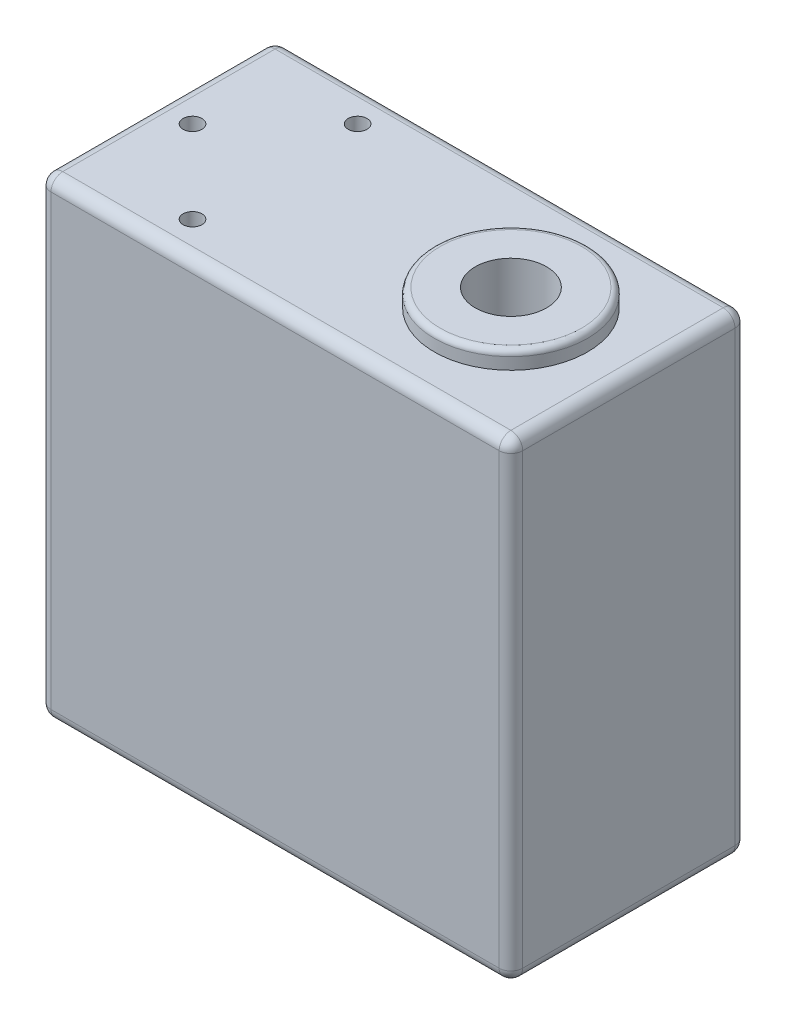
ISO-10303-21;
HEADER;
FILE_DESCRIPTION(('STEP AP214'),'2;1');
FILE_NAME('part.step','',(''),(''),'','','');
FILE_SCHEMA(('AUTOMOTIVE_DESIGN { 1 0 10303 214 1 1 1 1 }'));
ENDSEC;
DATA;
#1=APPLICATION_CONTEXT('core data for automotive mechanical design processes');
#2=APPLICATION_PROTOCOL_DEFINITION('international standard','automotive_design',2000,#1);
#3=PRODUCT_CONTEXT('',#1,'mechanical');
#4=PRODUCT('Part','Part','',(#3));
#5=PRODUCT_RELATED_PRODUCT_CATEGORY('part','',(#4));
#6=PRODUCT_DEFINITION_FORMATION('','',#4);
#7=PRODUCT_DEFINITION_CONTEXT('part definition',#1,'design');
#8=PRODUCT_DEFINITION('design','',#6,#7);
#9=PRODUCT_DEFINITION_SHAPE('','',#8);
#10=(LENGTH_UNIT() NAMED_UNIT(*) SI_UNIT(.MILLI.,.METRE.));
#11=(NAMED_UNIT(*) PLANE_ANGLE_UNIT() SI_UNIT($,.RADIAN.));
#12=(NAMED_UNIT(*) SI_UNIT($,.STERADIAN.) SOLID_ANGLE_UNIT());
#13=UNCERTAINTY_MEASURE_WITH_UNIT(LENGTH_MEASURE(1.E-05),#10,'distance_accuracy_value','');
#14=(GEOMETRIC_REPRESENTATION_CONTEXT(3) GLOBAL_UNCERTAINTY_ASSIGNED_CONTEXT((#13)) GLOBAL_UNIT_ASSIGNED_CONTEXT((#10,
#11,#12)) REPRESENTATION_CONTEXT('',''));
#15=CARTESIAN_POINT('',(0.,0.,0.));
#16=DIRECTION('',(0.,0.,1.));
#17=DIRECTION('',(1.,0.,0.));
#18=AXIS2_PLACEMENT_3D('',#15,#16,#17);
#19=CARTESIAN_POINT('',(20.,20.,10.));
#20=DIRECTION('',(-1.,0.,0.));
#21=DIRECTION('',(0.,-1.,0.));
#22=AXIS2_PLACEMENT_3D('',#19,#20,#21);
#23=PLANE('',#22);
#24=DIRECTION('',(0.,0.,-1.));
#25=VECTOR('',#24,1.);
#26=CARTESIAN_POINT('',(20.,-19.,10.));
#27=LINE('',#26,#25);
#28=CARTESIAN_POINT('',(20.,-19.,9.));
#29=VERTEX_POINT('',#28);
#30=CARTESIAN_POINT('',(20.,-19.,-9.));
#31=VERTEX_POINT('',#30);
#32=EDGE_CURVE('E189',#29,#31,#27,.T.);
#33=ORIENTED_EDGE('',*,*,#32,.T.);
#34=DIRECTION('',(0.,1.,0.));
#35=VECTOR('',#34,1.);
#36=CARTESIAN_POINT('',(20.,20.,-9.));
#37=LINE('',#36,#35);
#38=CARTESIAN_POINT('',(20.,19.,-9.));
#39=VERTEX_POINT('',#38);
#40=EDGE_CURVE('E192',#31,#39,#37,.T.);
#41=ORIENTED_EDGE('',*,*,#40,.T.);
#42=DIRECTION('',(0.,0.,-1.));
#43=VECTOR('',#42,1.);
#44=CARTESIAN_POINT('',(20.,19.,10.));
#45=LINE('',#44,#43);
#46=CARTESIAN_POINT('',(20.,19.,9.));
#47=VERTEX_POINT('',#46);
#48=EDGE_CURVE('E187',#39,#47,#45,.F.);
#49=ORIENTED_EDGE('',*,*,#48,.T.);
#50=DIRECTION('',(0.,1.,0.));
#51=VECTOR('',#50,1.);
#52=CARTESIAN_POINT('',(20.,-20.,9.));
#53=LINE('',#52,#51);
#54=EDGE_CURVE('E185',#47,#29,#53,.F.);
#55=ORIENTED_EDGE('',*,*,#54,.T.);
#56=EDGE_LOOP('',(#33,#41,#49,#55));
#57=FACE_BOUND('',#56,.T.);
#58=ADVANCED_FACE('F33',(#57),#23,.F.);
#59=CARTESIAN_POINT('',(-20.,20.,10.));
#60=DIRECTION('',(0.,-1.,0.));
#61=DIRECTION('',(0.,0.,-1.));
#62=AXIS2_PLACEMENT_3D('',#59,#60,#61);
#63=PLANE('',#62);
#64=CARTESIAN_POINT('',(10.,20.,0.));
#65=DIRECTION('',(0.,-1.,0.));
#66=DIRECTION('',(0.,0.,-1.));
#67=AXIS2_PLACEMENT_3D('',#64,#65,#66);
#68=CIRCLE('',#67,6.5);
#69=CARTESIAN_POINT('',(10.,20.,-6.5));
#70=VERTEX_POINT('',#69);
#71=EDGE_CURVE('E278',#70,#70,#68,.F.);
#72=ORIENTED_EDGE('',*,*,#71,.F.);
#73=EDGE_LOOP('',(#72));
#74=FACE_BOUND('',#73,.T.);
#75=CARTESIAN_POINT('',(-17.,20.,0.));
#76=DIRECTION('',(0.,1.,0.));
#77=DIRECTION('',(0.,0.,1.));
#78=AXIS2_PLACEMENT_3D('',#75,#76,#77);
#79=CIRCLE('',#78,0.799999999999999);
#80=CARTESIAN_POINT('',(-17.,20.,0.800000000000037));
#81=VERTEX_POINT('',#80);
#82=EDGE_CURVE('E424',#81,#81,#79,.T.);
#83=ORIENTED_EDGE('',*,*,#82,.F.);
#84=EDGE_LOOP('',(#83));
#85=FACE_BOUND('',#84,.T.);
#86=CARTESIAN_POINT('',(-9.99999999999994,20.,7.00000000000001));
#87=DIRECTION('',(0.,1.,0.));
#88=DIRECTION('',(0.,0.,1.));
#89=AXIS2_PLACEMENT_3D('',#86,#87,#88);
#90=CIRCLE('',#89,0.800000000000001);
#91=CARTESIAN_POINT('',(-9.99999999999994,20.,7.80000000000001));
#92=VERTEX_POINT('',#91);
#93=EDGE_CURVE('E267',#92,#92,#90,.T.);
#94=ORIENTED_EDGE('',*,*,#93,.F.);
#95=EDGE_LOOP('',(#94));
#96=FACE_BOUND('',#95,.T.);
#97=CARTESIAN_POINT('',(-10.,20.,-6.99999999999999));
#98=DIRECTION('',(0.,1.,0.));
#99=DIRECTION('',(0.,0.,1.));
#100=AXIS2_PLACEMENT_3D('',#97,#98,#99);
#101=CIRCLE('',#100,0.800000000000001);
#102=CARTESIAN_POINT('',(-10.,20.,-6.19999999999999));
#103=VERTEX_POINT('',#102);
#104=EDGE_CURVE('E423',#103,#103,#101,.T.);
#105=ORIENTED_EDGE('',*,*,#104,.F.);
#106=EDGE_LOOP('',(#105));
#107=FACE_BOUND('',#106,.T.);
#108=DIRECTION('',(0.,0.,-1.));
#109=VECTOR('',#108,1.);
#110=CARTESIAN_POINT('',(19.,20.,10.));
#111=LINE('',#110,#109);
#112=CARTESIAN_POINT('',(19.,20.,9.));
#113=VERTEX_POINT('',#112);
#114=CARTESIAN_POINT('',(19.,20.,-9.));
#115=VERTEX_POINT('',#114);
#116=EDGE_CURVE('E171',#113,#115,#111,.T.);
#117=ORIENTED_EDGE('',*,*,#116,.T.);
#118=DIRECTION('',(-1.,0.,0.));
#119=VECTOR('',#118,1.);
#120=CARTESIAN_POINT('',(-20.,20.,-9.));
#121=LINE('',#120,#119);
#122=CARTESIAN_POINT('',(-19.,20.,-9.));
#123=VERTEX_POINT('',#122);
#124=EDGE_CURVE('E176',#115,#123,#121,.T.);
#125=ORIENTED_EDGE('',*,*,#124,.T.);
#126=DIRECTION('',(0.,0.,-1.));
#127=VECTOR('',#126,1.);
#128=CARTESIAN_POINT('',(-19.,20.,10.));
#129=LINE('',#128,#127);
#130=CARTESIAN_POINT('',(-19.,20.,9.));
#131=VERTEX_POINT('',#130);
#132=EDGE_CURVE('E173',#123,#131,#129,.F.);
#133=ORIENTED_EDGE('',*,*,#132,.T.);
#134=DIRECTION('',(-1.,0.,0.));
#135=VECTOR('',#134,1.);
#136=CARTESIAN_POINT('',(20.,20.,9.));
#137=LINE('',#136,#135);
#138=EDGE_CURVE('E169',#131,#113,#137,.F.);
#139=ORIENTED_EDGE('',*,*,#138,.T.);
#140=EDGE_LOOP('',(#117,#125,#133,#139));
#141=FACE_BOUND('',#140,.T.);
#142=ADVANCED_FACE('F297',(#74,#85,#96,#107,#141),#63,.F.);
#143=CARTESIAN_POINT('',(-20.,20.,10.));
#144=DIRECTION('',(1.,0.,0.));
#145=DIRECTION('',(0.,1.,0.));
#146=AXIS2_PLACEMENT_3D('',#143,#144,#145);
#147=PLANE('',#146);
#148=DIRECTION('',(0.,0.,-1.));
#149=VECTOR('',#148,1.);
#150=CARTESIAN_POINT('',(-20.,19.,10.));
#151=LINE('',#150,#149);
#152=CARTESIAN_POINT('',(-20.,19.,9.));
#153=VERTEX_POINT('',#152);
#154=CARTESIAN_POINT('',(-20.,19.,-9.));
#155=VERTEX_POINT('',#154);
#156=EDGE_CURVE('E132',#153,#155,#151,.T.);
#157=ORIENTED_EDGE('',*,*,#156,.T.);
#158=DIRECTION('',(0.,-1.,0.));
#159=VECTOR('',#158,1.);
#160=CARTESIAN_POINT('',(-20.,20.,-9.));
#161=LINE('',#160,#159);
#162=CARTESIAN_POINT('',(-20.,-19.,-9.));
#163=VERTEX_POINT('',#162);
#164=EDGE_CURVE('E128',#155,#163,#161,.T.);
#165=ORIENTED_EDGE('',*,*,#164,.T.);
#166=DIRECTION('',(0.,0.,-1.));
#167=VECTOR('',#166,1.);
#168=CARTESIAN_POINT('',(-20.,-19.,10.));
#169=LINE('',#168,#167);
#170=CARTESIAN_POINT('',(-20.,-19.,9.));
#171=VERTEX_POINT('',#170);
#172=EDGE_CURVE('E120',#163,#171,#169,.F.);
#173=ORIENTED_EDGE('',*,*,#172,.T.);
#174=DIRECTION('',(0.,-1.,0.));
#175=VECTOR('',#174,1.);
#176=CARTESIAN_POINT('',(-20.,20.,9.));
#177=LINE('',#176,#175);
#178=EDGE_CURVE('E125',#171,#153,#177,.F.);
#179=ORIENTED_EDGE('',*,*,#178,.T.);
#180=EDGE_LOOP('',(#157,#165,#173,#179));
#181=FACE_BOUND('',#180,.T.);
#182=ADVANCED_FACE('F123',(#181),#147,.F.);
#183=CARTESIAN_POINT('',(-20.,-20.,10.));
#184=DIRECTION('',(0.,1.,0.));
#185=DIRECTION('',(0.,0.,1.));
#186=AXIS2_PLACEMENT_3D('',#183,#184,#185);
#187=PLANE('',#186);
#188=CARTESIAN_POINT('',(10.,-20.,0.));
#189=DIRECTION('',(0.,1.,0.));
#190=DIRECTION('',(0.,0.,1.));
#191=AXIS2_PLACEMENT_3D('',#188,#189,#190);
#192=CIRCLE('',#191,6.5);
#193=CARTESIAN_POINT('',(10.,-20.,6.5));
#194=VERTEX_POINT('',#193);
#195=EDGE_CURVE('E209',#194,#194,#192,.F.);
#196=ORIENTED_EDGE('',*,*,#195,.F.);
#197=EDGE_LOOP('',(#196));
#198=FACE_BOUND('',#197,.T.);
#199=CARTESIAN_POINT('',(-2.49999999999997,-20.,7.49999999999997));
#200=DIRECTION('',(0.,-1.,0.));
#201=DIRECTION('',(0.,0.,-1.));
#202=AXIS2_PLACEMENT_3D('',#199,#200,#201);
#203=CIRCLE('',#202,0.800000000000001);
#204=CARTESIAN_POINT('',(-2.49999999999997,-20.,6.69999999999997));
#205=VERTEX_POINT('',#204);
#206=EDGE_CURVE('E441',#205,#205,#203,.T.);
#207=ORIENTED_EDGE('',*,*,#206,.F.);
#208=EDGE_LOOP('',(#207));
#209=FACE_BOUND('',#208,.T.);
#210=CARTESIAN_POINT('',(-2.50000000000005,-20.,-7.50000000000005));
#211=DIRECTION('',(0.,-1.,0.));
#212=DIRECTION('',(0.,0.,-1.));
#213=AXIS2_PLACEMENT_3D('',#210,#211,#212);
#214=CIRCLE('',#213,0.799999999999997);
#215=CARTESIAN_POINT('',(-2.50000000000005,-20.,-8.30000000000005));
#216=VERTEX_POINT('',#215);
#217=EDGE_CURVE('E447',#216,#216,#214,.T.);
#218=ORIENTED_EDGE('',*,*,#217,.F.);
#219=EDGE_LOOP('',(#218));
#220=FACE_BOUND('',#219,.T.);
#221=CARTESIAN_POINT('',(-17.5000000000001,-20.,-7.49999999999992));
#222=DIRECTION('',(0.,-1.,0.));
#223=DIRECTION('',(0.,0.,-1.));
#224=AXIS2_PLACEMENT_3D('',#221,#222,#223);
#225=CIRCLE('',#224,0.8);
#226=CARTESIAN_POINT('',(-17.5000000000001,-20.,-8.29999999999992));
#227=VERTEX_POINT('',#226);
#228=EDGE_CURVE('E435',#227,#227,#225,.T.);
#229=ORIENTED_EDGE('',*,*,#228,.F.);
#230=EDGE_LOOP('',(#229));
#231=FACE_BOUND('',#230,.T.);
#232=CARTESIAN_POINT('',(-17.5,-20.,7.5));
#233=DIRECTION('',(0.,-1.,0.));
#234=DIRECTION('',(0.,0.,-1.));
#235=AXIS2_PLACEMENT_3D('',#232,#233,#234);
#236=CIRCLE('',#235,0.799999999999999);
#237=CARTESIAN_POINT('',(-17.5,-20.,6.7));
#238=VERTEX_POINT('',#237);
#239=EDGE_CURVE('E164',#238,#238,#236,.T.);
#240=ORIENTED_EDGE('',*,*,#239,.F.);
#241=EDGE_LOOP('',(#240));
#242=FACE_BOUND('',#241,.T.);
#243=DIRECTION('',(0.,0.,-1.));
#244=VECTOR('',#243,1.);
#245=CARTESIAN_POINT('',(-19.,-20.,10.));
#246=LINE('',#245,#244);
#247=CARTESIAN_POINT('',(-19.,-20.,9.));
#248=VERTEX_POINT('',#247);
#249=CARTESIAN_POINT('',(-19.,-20.,-9.));
#250=VERTEX_POINT('',#249);
#251=EDGE_CURVE('E140',#248,#250,#246,.T.);
#252=ORIENTED_EDGE('',*,*,#251,.T.);
#253=DIRECTION('',(1.,0.,0.));
#254=VECTOR('',#253,1.);
#255=CARTESIAN_POINT('',(-20.,-20.,-9.));
#256=LINE('',#255,#254);
#257=CARTESIAN_POINT('',(19.,-20.,-9.));
#258=VERTEX_POINT('',#257);
#259=EDGE_CURVE('E183',#250,#258,#256,.T.);
#260=ORIENTED_EDGE('',*,*,#259,.T.);
#261=DIRECTION('',(0.,0.,-1.));
#262=VECTOR('',#261,1.);
#263=CARTESIAN_POINT('',(19.,-20.,10.));
#264=LINE('',#263,#262);
#265=CARTESIAN_POINT('',(19.,-20.,9.));
#266=VERTEX_POINT('',#265);
#267=EDGE_CURVE('E180',#258,#266,#264,.F.);
#268=ORIENTED_EDGE('',*,*,#267,.T.);
#269=DIRECTION('',(1.,0.,0.));
#270=VECTOR('',#269,1.);
#271=CARTESIAN_POINT('',(-20.,-20.,9.));
#272=LINE('',#271,#270);
#273=EDGE_CURVE('E178',#266,#248,#272,.F.);
#274=ORIENTED_EDGE('',*,*,#273,.T.);
#275=EDGE_LOOP('',(#252,#260,#268,#274));
#276=FACE_BOUND('',#275,.T.);
#277=ADVANCED_FACE('F461',(#198,#209,#220,#231,#242,#276),#187,.F.);
#278=CARTESIAN_POINT('',(0.,0.,10.));
#279=DIRECTION('',(0.,0.,1.));
#280=DIRECTION('',(1.,0.,0.));
#281=AXIS2_PLACEMENT_3D('',#278,#279,#280);
#282=PLANE('',#281);
#283=DIRECTION('',(0.,-1.,0.));
#284=VECTOR('',#283,1.);
#285=CARTESIAN_POINT('',(-19.,-20.,10.));
#286=LINE('',#285,#284);
#287=CARTESIAN_POINT('',(-19.,19.,10.));
#288=VERTEX_POINT('',#287);
#289=CARTESIAN_POINT('',(-19.,-19.,10.));
#290=VERTEX_POINT('',#289);
#291=EDGE_CURVE('E48',#288,#290,#286,.T.);
#292=ORIENTED_EDGE('',*,*,#291,.T.);
#293=DIRECTION('',(1.,0.,0.));
#294=VECTOR('',#293,1.);
#295=CARTESIAN_POINT('',(20.,-19.,10.));
#296=LINE('',#295,#294);
#297=CARTESIAN_POINT('',(19.,-19.,10.));
#298=VERTEX_POINT('',#297);
#299=EDGE_CURVE('E207',#290,#298,#296,.T.);
#300=ORIENTED_EDGE('',*,*,#299,.T.);
#301=DIRECTION('',(0.,1.,0.));
#302=VECTOR('',#301,1.);
#303=CARTESIAN_POINT('',(19.,20.,10.));
#304=LINE('',#303,#302);
#305=CARTESIAN_POINT('',(19.,19.,10.));
#306=VERTEX_POINT('',#305);
#307=EDGE_CURVE('E203',#298,#306,#304,.T.);
#308=ORIENTED_EDGE('',*,*,#307,.T.);
#309=DIRECTION('',(-1.,0.,0.));
#310=VECTOR('',#309,1.);
#311=CARTESIAN_POINT('',(-20.,19.,10.));
#312=LINE('',#311,#310);
#313=EDGE_CURVE('E53',#306,#288,#312,.T.);
#314=ORIENTED_EDGE('',*,*,#313,.T.);
#315=EDGE_LOOP('',(#292,#300,#308,#314));
#316=FACE_BOUND('',#315,.T.);
#317=ADVANCED_FACE('F464',(#316),#282,.T.);
#318=CARTESIAN_POINT('',(0.,0.,-10.));
#319=DIRECTION('',(0.,0.,1.));
#320=DIRECTION('',(1.,0.,0.));
#321=AXIS2_PLACEMENT_3D('',#318,#319,#320);
#322=PLANE('',#321);
#323=DIRECTION('',(0.,-1.,0.));
#324=VECTOR('',#323,1.);
#325=CARTESIAN_POINT('',(-19.,0.,-10.));
#326=LINE('',#325,#324);
#327=CARTESIAN_POINT('',(-19.,-19.,-10.));
#328=VERTEX_POINT('',#327);
#329=CARTESIAN_POINT('',(-19.,19.,-10.));
#330=VERTEX_POINT('',#329);
#331=EDGE_CURVE('E198',#328,#330,#326,.F.);
#332=ORIENTED_EDGE('',*,*,#331,.T.);
#333=DIRECTION('',(-1.,0.,0.));
#334=VECTOR('',#333,1.);
#335=CARTESIAN_POINT('',(0.,19.,-10.));
#336=LINE('',#335,#334);
#337=CARTESIAN_POINT('',(19.,19.,-10.));
#338=VERTEX_POINT('',#337);
#339=EDGE_CURVE('E200',#330,#338,#336,.F.);
#340=ORIENTED_EDGE('',*,*,#339,.T.);
#341=DIRECTION('',(0.,1.,0.));
#342=VECTOR('',#341,1.);
#343=CARTESIAN_POINT('',(19.,0.,-10.));
#344=LINE('',#343,#342);
#345=CARTESIAN_POINT('',(19.,-19.,-10.));
#346=VERTEX_POINT('',#345);
#347=EDGE_CURVE('E194',#338,#346,#344,.F.);
#348=ORIENTED_EDGE('',*,*,#347,.T.);
#349=DIRECTION('',(1.,0.,0.));
#350=VECTOR('',#349,1.);
#351=CARTESIAN_POINT('',(0.,-19.,-10.));
#352=LINE('',#351,#350);
#353=EDGE_CURVE('E196',#346,#328,#352,.F.);
#354=ORIENTED_EDGE('',*,*,#353,.T.);
#355=EDGE_LOOP('',(#332,#340,#348,#354));
#356=FACE_BOUND('',#355,.T.);
#357=ADVANCED_FACE('F381',(#356),#322,.F.);
#358=CARTESIAN_POINT('',(19.,-19.,10.));
#359=DIRECTION('',(0.,0.,-1.));
#360=DIRECTION('',(-1.,0.,0.));
#361=AXIS2_PLACEMENT_3D('',#358,#359,#360);
#362=CYLINDRICAL_SURFACE('',#361,1.);
#363=CARTESIAN_POINT('',(19.,-19.,9.));
#364=DIRECTION('',(0.,0.,1.));
#365=DIRECTION('',(1.,0.,0.));
#366=AXIS2_PLACEMENT_3D('',#363,#364,#365);
#367=CIRCLE('',#366,1.);
#368=EDGE_CURVE('E158',#266,#29,#367,.T.);
#369=ORIENTED_EDGE('',*,*,#368,.F.);
#370=ORIENTED_EDGE('',*,*,#267,.F.);
#371=CARTESIAN_POINT('',(19.,-19.,-9.));
#372=DIRECTION('',(0.,0.,-1.));
#373=DIRECTION('',(-1.,0.,0.));
#374=AXIS2_PLACEMENT_3D('',#371,#372,#373);
#375=CIRCLE('',#374,1.);
#376=EDGE_CURVE('E161',#31,#258,#375,.T.);
#377=ORIENTED_EDGE('',*,*,#376,.F.);
#378=ORIENTED_EDGE('',*,*,#32,.F.);
#379=EDGE_LOOP('',(#369,#370,#377,#378));
#380=FACE_BOUND('',#379,.T.);
#381=ADVANCED_FACE('F378',(#380),#362,.T.);
#382=CARTESIAN_POINT('',(19.,-19.,9.));
#383=DIRECTION('',(0.,0.,1.));
#384=DIRECTION('',(1.,0.,0.));
#385=AXIS2_PLACEMENT_3D('',#382,#383,#384);
#386=SPHERICAL_SURFACE('',#385,1.);
#387=CARTESIAN_POINT('',(19.,-19.,9.));
#388=DIRECTION('',(1.,0.,0.));
#389=DIRECTION('',(0.,0.,-1.));
#390=AXIS2_PLACEMENT_3D('',#387,#388,#389);
#391=CIRCLE('',#390,1.);
#392=EDGE_CURVE('E253',#266,#298,#391,.F.);
#393=ORIENTED_EDGE('',*,*,#392,.F.);
#394=ORIENTED_EDGE('',*,*,#368,.T.);
#395=CARTESIAN_POINT('',(19.,-19.,9.));
#396=DIRECTION('',(0.,-1.,0.));
#397=DIRECTION('',(0.,0.,-1.));
#398=AXIS2_PLACEMENT_3D('',#395,#396,#397);
#399=CIRCLE('',#398,1.);
#400=EDGE_CURVE('E256',#298,#29,#399,.F.);
#401=ORIENTED_EDGE('',*,*,#400,.F.);
#402=EDGE_LOOP('',(#393,#394,#401));
#403=FACE_BOUND('',#402,.T.);
#404=ADVANCED_FACE('F374',(#403),#386,.T.);
#405=CARTESIAN_POINT('',(19.,-19.,-9.));
#406=DIRECTION('',(0.,0.,1.));
#407=DIRECTION('',(1.,0.,0.));
#408=AXIS2_PLACEMENT_3D('',#405,#406,#407);
#409=SPHERICAL_SURFACE('',#408,1.);
#410=CARTESIAN_POINT('',(19.,-19.,-9.));
#411=DIRECTION('',(0.,-1.,0.));
#412=DIRECTION('',(0.,0.,-1.));
#413=AXIS2_PLACEMENT_3D('',#410,#411,#412);
#414=CIRCLE('',#413,1.);
#415=EDGE_CURVE('E247',#31,#346,#414,.F.);
#416=ORIENTED_EDGE('',*,*,#415,.F.);
#417=ORIENTED_EDGE('',*,*,#376,.T.);
#418=CARTESIAN_POINT('',(19.,-19.,-9.));
#419=DIRECTION('',(1.,0.,0.));
#420=DIRECTION('',(0.,0.,-1.));
#421=AXIS2_PLACEMENT_3D('',#418,#419,#420);
#422=CIRCLE('',#421,1.);
#423=EDGE_CURVE('E250',#346,#258,#422,.F.);
#424=ORIENTED_EDGE('',*,*,#423,.F.);
#425=EDGE_LOOP('',(#416,#417,#424));
#426=FACE_BOUND('',#425,.T.);
#427=ADVANCED_FACE('F370',(#426),#409,.T.);
#428=CARTESIAN_POINT('',(19.,0.,9.));
#429=DIRECTION('',(0.,-1.,0.));
#430=DIRECTION('',(1.,0.,0.));
#431=AXIS2_PLACEMENT_3D('',#428,#429,#430);
#432=CYLINDRICAL_SURFACE('',#431,1.);
#433=ORIENTED_EDGE('',*,*,#400,.T.);
#434=ORIENTED_EDGE('',*,*,#54,.F.);
#435=CARTESIAN_POINT('',(19.,19.,9.));
#436=DIRECTION('',(0.,1.,0.));
#437=DIRECTION('',(0.,0.,1.));
#438=AXIS2_PLACEMENT_3D('',#435,#436,#437);
#439=CIRCLE('',#438,1.);
#440=EDGE_CURVE('E241',#306,#47,#439,.T.);
#441=ORIENTED_EDGE('',*,*,#440,.F.);
#442=ORIENTED_EDGE('',*,*,#307,.F.);
#443=EDGE_LOOP('',(#433,#434,#441,#442));
#444=FACE_BOUND('',#443,.T.);
#445=ADVANCED_FACE('F366',(#444),#432,.T.);
#446=CARTESIAN_POINT('',(0.,-19.,9.));
#447=DIRECTION('',(-1.,0.,0.));
#448=DIRECTION('',(0.,0.,1.));
#449=AXIS2_PLACEMENT_3D('',#446,#447,#448);
#450=CYLINDRICAL_SURFACE('',#449,1.);
#451=ORIENTED_EDGE('',*,*,#392,.T.);
#452=ORIENTED_EDGE('',*,*,#299,.F.);
#453=CARTESIAN_POINT('',(-19.,-19.,9.));
#454=DIRECTION('',(-1.,0.,0.));
#455=DIRECTION('',(0.,0.,1.));
#456=AXIS2_PLACEMENT_3D('',#453,#454,#455);
#457=CIRCLE('',#456,1.);
#458=EDGE_CURVE('E144',#248,#290,#457,.T.);
#459=ORIENTED_EDGE('',*,*,#458,.F.);
#460=ORIENTED_EDGE('',*,*,#273,.F.);
#461=EDGE_LOOP('',(#451,#452,#459,#460));
#462=FACE_BOUND('',#461,.T.);
#463=ADVANCED_FACE('F363',(#462),#450,.T.);
#464=CARTESIAN_POINT('',(-19.,-19.,10.));
#465=DIRECTION('',(0.,0.,-1.));
#466=DIRECTION('',(-1.,0.,0.));
#467=AXIS2_PLACEMENT_3D('',#464,#465,#466);
#468=CYLINDRICAL_SURFACE('',#467,1.);
#469=CARTESIAN_POINT('',(-19.,-19.,-9.));
#470=DIRECTION('',(0.,0.,-1.));
#471=DIRECTION('',(-1.,0.,0.));
#472=AXIS2_PLACEMENT_3D('',#469,#470,#471);
#473=CIRCLE('',#472,1.);
#474=EDGE_CURVE('E145',#250,#163,#473,.T.);
#475=ORIENTED_EDGE('',*,*,#474,.F.);
#476=ORIENTED_EDGE('',*,*,#251,.F.);
#477=CARTESIAN_POINT('',(-19.,-19.,9.));
#478=DIRECTION('',(0.,0.,1.));
#479=DIRECTION('',(1.,0.,0.));
#480=AXIS2_PLACEMENT_3D('',#477,#478,#479);
#481=CIRCLE('',#480,1.);
#482=EDGE_CURVE('E136',#171,#248,#481,.T.);
#483=ORIENTED_EDGE('',*,*,#482,.F.);
#484=ORIENTED_EDGE('',*,*,#172,.F.);
#485=EDGE_LOOP('',(#475,#476,#483,#484));
#486=FACE_BOUND('',#485,.T.);
#487=ADVANCED_FACE('F138',(#486),#468,.T.);
#488=CARTESIAN_POINT('',(-20.,-19.,-9.));
#489=DIRECTION('',(1.,0.,0.));
#490=DIRECTION('',(0.,0.,-1.));
#491=AXIS2_PLACEMENT_3D('',#488,#489,#490);
#492=CYLINDRICAL_SURFACE('',#491,1.);
#493=ORIENTED_EDGE('',*,*,#423,.T.);
#494=ORIENTED_EDGE('',*,*,#259,.F.);
#495=CARTESIAN_POINT('',(-19.,-19.,-9.));
#496=DIRECTION('',(-1.,0.,0.));
#497=DIRECTION('',(0.,0.,1.));
#498=AXIS2_PLACEMENT_3D('',#495,#496,#497);
#499=CIRCLE('',#498,1.);
#500=EDGE_CURVE('E237',#328,#250,#499,.T.);
#501=ORIENTED_EDGE('',*,*,#500,.F.);
#502=ORIENTED_EDGE('',*,*,#353,.F.);
#503=EDGE_LOOP('',(#493,#494,#501,#502));
#504=FACE_BOUND('',#503,.T.);
#505=ADVANCED_FACE('F356',(#504),#492,.T.);
#506=CARTESIAN_POINT('',(19.,20.,-9.));
#507=DIRECTION('',(0.,1.,0.));
#508=DIRECTION('',(-1.,0.,0.));
#509=AXIS2_PLACEMENT_3D('',#506,#507,#508);
#510=CYLINDRICAL_SURFACE('',#509,1.);
#511=ORIENTED_EDGE('',*,*,#415,.T.);
#512=ORIENTED_EDGE('',*,*,#347,.F.);
#513=CARTESIAN_POINT('',(19.,19.,-9.));
#514=DIRECTION('',(0.,1.,0.));
#515=DIRECTION('',(0.,0.,1.));
#516=AXIS2_PLACEMENT_3D('',#513,#514,#515);
#517=CIRCLE('',#516,1.);
#518=EDGE_CURVE('E234',#39,#338,#517,.T.);
#519=ORIENTED_EDGE('',*,*,#518,.F.);
#520=ORIENTED_EDGE('',*,*,#40,.F.);
#521=EDGE_LOOP('',(#511,#512,#519,#520));
#522=FACE_BOUND('',#521,.T.);
#523=ADVANCED_FACE('F352',(#522),#510,.T.);
#524=CARTESIAN_POINT('',(19.,19.,10.));
#525=DIRECTION('',(0.,0.,-1.));
#526=DIRECTION('',(-1.,0.,0.));
#527=AXIS2_PLACEMENT_3D('',#524,#525,#526);
#528=CYLINDRICAL_SURFACE('',#527,1.);
#529=CARTESIAN_POINT('',(19.,19.,9.));
#530=DIRECTION('',(0.,0.,1.));
#531=DIRECTION('',(1.,0.,0.));
#532=AXIS2_PLACEMENT_3D('',#529,#530,#531);
#533=CIRCLE('',#532,1.);
#534=EDGE_CURVE('E244',#47,#113,#533,.T.);
#535=ORIENTED_EDGE('',*,*,#534,.F.);
#536=ORIENTED_EDGE('',*,*,#48,.F.);
#537=CARTESIAN_POINT('',(19.,19.,-9.));
#538=DIRECTION('',(0.,0.,-1.));
#539=DIRECTION('',(-1.,0.,0.));
#540=AXIS2_PLACEMENT_3D('',#537,#538,#539);
#541=CIRCLE('',#540,1.);
#542=EDGE_CURVE('E231',#115,#39,#541,.T.);
#543=ORIENTED_EDGE('',*,*,#542,.F.);
#544=ORIENTED_EDGE('',*,*,#116,.F.);
#545=EDGE_LOOP('',(#535,#536,#543,#544));
#546=FACE_BOUND('',#545,.T.);
#547=ADVANCED_FACE('F348',(#546),#528,.T.);
#548=CARTESIAN_POINT('',(19.,19.,9.));
#549=DIRECTION('',(0.,0.,1.));
#550=DIRECTION('',(1.,0.,0.));
#551=AXIS2_PLACEMENT_3D('',#548,#549,#550);
#552=SPHERICAL_SURFACE('',#551,1.);
#553=ORIENTED_EDGE('',*,*,#440,.T.);
#554=ORIENTED_EDGE('',*,*,#534,.T.);
#555=CARTESIAN_POINT('',(19.,19.,9.));
#556=DIRECTION('',(1.,0.,0.));
#557=DIRECTION('',(0.,0.,-1.));
#558=AXIS2_PLACEMENT_3D('',#555,#556,#557);
#559=CIRCLE('',#558,1.);
#560=EDGE_CURVE('E151',#306,#113,#559,.F.);
#561=ORIENTED_EDGE('',*,*,#560,.F.);
#562=EDGE_LOOP('',(#553,#554,#561));
#563=FACE_BOUND('',#562,.T.);
#564=ADVANCED_FACE('F345',(#563),#552,.T.);
#565=CARTESIAN_POINT('',(-19.,-19.,9.));
#566=DIRECTION('',(0.,0.,1.));
#567=DIRECTION('',(1.,0.,0.));
#568=AXIS2_PLACEMENT_3D('',#565,#566,#567);
#569=SPHERICAL_SURFACE('',#568,1.);
#570=ORIENTED_EDGE('',*,*,#482,.T.);
#571=ORIENTED_EDGE('',*,*,#458,.T.);
#572=CARTESIAN_POINT('',(-19.,-19.,9.));
#573=DIRECTION('',(0.,-1.,0.));
#574=DIRECTION('',(0.,0.,-1.));
#575=AXIS2_PLACEMENT_3D('',#572,#573,#574);
#576=CIRCLE('',#575,1.);
#577=EDGE_CURVE('E148',#171,#290,#576,.F.);
#578=ORIENTED_EDGE('',*,*,#577,.F.);
#579=EDGE_LOOP('',(#570,#571,#578));
#580=FACE_BOUND('',#579,.T.);
#581=ADVANCED_FACE('F149',(#580),#569,.T.);
#582=CARTESIAN_POINT('',(-19.,-19.,-9.));
#583=DIRECTION('',(0.,0.,1.));
#584=DIRECTION('',(1.,0.,0.));
#585=AXIS2_PLACEMENT_3D('',#582,#583,#584);
#586=SPHERICAL_SURFACE('',#585,1.);
#587=ORIENTED_EDGE('',*,*,#500,.T.);
#588=ORIENTED_EDGE('',*,*,#474,.T.);
#589=CARTESIAN_POINT('',(-19.,-19.,-9.));
#590=DIRECTION('',(0.,-1.,0.));
#591=DIRECTION('',(0.,0.,-1.));
#592=AXIS2_PLACEMENT_3D('',#589,#590,#591);
#593=CIRCLE('',#592,1.);
#594=EDGE_CURVE('E152',#328,#163,#593,.F.);
#595=ORIENTED_EDGE('',*,*,#594,.F.);
#596=EDGE_LOOP('',(#587,#588,#595));
#597=FACE_BOUND('',#596,.T.);
#598=ADVANCED_FACE('F338',(#597),#586,.T.);
#599=CARTESIAN_POINT('',(19.,19.,-9.));
#600=DIRECTION('',(0.,0.,1.));
#601=DIRECTION('',(1.,0.,0.));
#602=AXIS2_PLACEMENT_3D('',#599,#600,#601);
#603=SPHERICAL_SURFACE('',#602,1.);
#604=ORIENTED_EDGE('',*,*,#542,.T.);
#605=ORIENTED_EDGE('',*,*,#518,.T.);
#606=CARTESIAN_POINT('',(19.,19.,-9.));
#607=DIRECTION('',(1.,0.,0.));
#608=DIRECTION('',(0.,0.,-1.));
#609=AXIS2_PLACEMENT_3D('',#606,#607,#608);
#610=CIRCLE('',#609,1.);
#611=EDGE_CURVE('E225',#115,#338,#610,.F.);
#612=ORIENTED_EDGE('',*,*,#611,.F.);
#613=EDGE_LOOP('',(#604,#605,#612));
#614=FACE_BOUND('',#613,.T.);
#615=ADVANCED_FACE('F334',(#614),#603,.T.);
#616=CARTESIAN_POINT('',(0.,19.,9.));
#617=DIRECTION('',(1.,0.,0.));
#618=DIRECTION('',(0.,0.,-1.));
#619=AXIS2_PLACEMENT_3D('',#616,#617,#618);
#620=CYLINDRICAL_SURFACE('',#619,1.);
#621=ORIENTED_EDGE('',*,*,#560,.T.);
#622=ORIENTED_EDGE('',*,*,#138,.F.);
#623=CARTESIAN_POINT('',(-19.,19.,9.));
#624=DIRECTION('',(-1.,0.,0.));
#625=DIRECTION('',(0.,0.,1.));
#626=AXIS2_PLACEMENT_3D('',#623,#624,#625);
#627=CIRCLE('',#626,1.);
#628=EDGE_CURVE('E222',#288,#131,#627,.T.);
#629=ORIENTED_EDGE('',*,*,#628,.F.);
#630=ORIENTED_EDGE('',*,*,#313,.F.);
#631=EDGE_LOOP('',(#621,#622,#629,#630));
#632=FACE_BOUND('',#631,.T.);
#633=ADVANCED_FACE('F331',(#632),#620,.T.);
#634=CARTESIAN_POINT('',(-19.,0.,9.));
#635=DIRECTION('',(0.,1.,0.));
#636=DIRECTION('',(-1.,0.,0.));
#637=AXIS2_PLACEMENT_3D('',#634,#635,#636);
#638=CYLINDRICAL_SURFACE('',#637,1.);
#639=ORIENTED_EDGE('',*,*,#577,.T.);
#640=ORIENTED_EDGE('',*,*,#291,.F.);
#641=CARTESIAN_POINT('',(-19.,19.,9.));
#642=DIRECTION('',(0.,1.,0.));
#643=DIRECTION('',(0.,0.,1.));
#644=AXIS2_PLACEMENT_3D('',#641,#642,#643);
#645=CIRCLE('',#644,1.);
#646=EDGE_CURVE('E156',#153,#288,#645,.T.);
#647=ORIENTED_EDGE('',*,*,#646,.F.);
#648=ORIENTED_EDGE('',*,*,#178,.F.);
#649=EDGE_LOOP('',(#639,#640,#647,#648));
#650=FACE_BOUND('',#649,.T.);
#651=ADVANCED_FACE('F154',(#650),#638,.T.);
#652=CARTESIAN_POINT('',(-19.,20.,-9.));
#653=DIRECTION('',(0.,-1.,0.));
#654=DIRECTION('',(1.,0.,0.));
#655=AXIS2_PLACEMENT_3D('',#652,#653,#654);
#656=CYLINDRICAL_SURFACE('',#655,1.);
#657=ORIENTED_EDGE('',*,*,#594,.T.);
#658=ORIENTED_EDGE('',*,*,#164,.F.);
#659=CARTESIAN_POINT('',(-19.,19.,-9.));
#660=DIRECTION('',(0.,1.,0.));
#661=DIRECTION('',(0.,0.,1.));
#662=AXIS2_PLACEMENT_3D('',#659,#660,#661);
#663=CIRCLE('',#662,1.);
#664=EDGE_CURVE('E218',#330,#155,#663,.T.);
#665=ORIENTED_EDGE('',*,*,#664,.F.);
#666=ORIENTED_EDGE('',*,*,#331,.F.);
#667=EDGE_LOOP('',(#657,#658,#665,#666));
#668=FACE_BOUND('',#667,.T.);
#669=ADVANCED_FACE('F324',(#668),#656,.T.);
#670=CARTESIAN_POINT('',(-20.,19.,-9.));
#671=DIRECTION('',(-1.,0.,0.));
#672=DIRECTION('',(0.,0.,1.));
#673=AXIS2_PLACEMENT_3D('',#670,#671,#672);
#674=CYLINDRICAL_SURFACE('',#673,1.);
#675=ORIENTED_EDGE('',*,*,#611,.T.);
#676=ORIENTED_EDGE('',*,*,#339,.F.);
#677=CARTESIAN_POINT('',(-19.,19.,-9.));
#678=DIRECTION('',(-1.,0.,0.));
#679=DIRECTION('',(0.,0.,1.));
#680=AXIS2_PLACEMENT_3D('',#677,#678,#679);
#681=CIRCLE('',#680,1.);
#682=EDGE_CURVE('E215',#123,#330,#681,.T.);
#683=ORIENTED_EDGE('',*,*,#682,.F.);
#684=ORIENTED_EDGE('',*,*,#124,.F.);
#685=EDGE_LOOP('',(#675,#676,#683,#684));
#686=FACE_BOUND('',#685,.T.);
#687=ADVANCED_FACE('F320',(#686),#674,.T.);
#688=CARTESIAN_POINT('',(-19.,19.,9.));
#689=DIRECTION('',(0.,0.,1.));
#690=DIRECTION('',(1.,0.,0.));
#691=AXIS2_PLACEMENT_3D('',#688,#689,#690);
#692=SPHERICAL_SURFACE('',#691,1.);
#693=ORIENTED_EDGE('',*,*,#646,.T.);
#694=ORIENTED_EDGE('',*,*,#628,.T.);
#695=CARTESIAN_POINT('',(-19.,19.,9.));
#696=DIRECTION('',(0.,0.,1.));
#697=DIRECTION('',(1.,0.,0.));
#698=AXIS2_PLACEMENT_3D('',#695,#696,#697);
#699=CIRCLE('',#698,1.);
#700=EDGE_CURVE('E212',#153,#131,#699,.F.);
#701=ORIENTED_EDGE('',*,*,#700,.F.);
#702=EDGE_LOOP('',(#693,#694,#701));
#703=FACE_BOUND('',#702,.T.);
#704=ADVANCED_FACE('F316',(#703),#692,.T.);
#705=CARTESIAN_POINT('',(-19.,19.,-9.));
#706=DIRECTION('',(0.,0.,1.));
#707=DIRECTION('',(1.,0.,0.));
#708=AXIS2_PLACEMENT_3D('',#705,#706,#707);
#709=SPHERICAL_SURFACE('',#708,1.);
#710=ORIENTED_EDGE('',*,*,#682,.T.);
#711=ORIENTED_EDGE('',*,*,#664,.T.);
#712=CARTESIAN_POINT('',(-19.,19.,-9.));
#713=DIRECTION('',(0.,0.,-1.));
#714=DIRECTION('',(-1.,0.,0.));
#715=AXIS2_PLACEMENT_3D('',#712,#713,#714);
#716=CIRCLE('',#715,1.);
#717=EDGE_CURVE('E210',#123,#155,#716,.F.);
#718=ORIENTED_EDGE('',*,*,#717,.F.);
#719=EDGE_LOOP('',(#710,#711,#718));
#720=FACE_BOUND('',#719,.T.);
#721=ADVANCED_FACE('F312',(#720),#709,.T.);
#722=CARTESIAN_POINT('',(-19.,19.,10.));
#723=DIRECTION('',(0.,0.,-1.));
#724=DIRECTION('',(-1.,0.,0.));
#725=AXIS2_PLACEMENT_3D('',#722,#723,#724);
#726=CYLINDRICAL_SURFACE('',#725,1.);
#727=ORIENTED_EDGE('',*,*,#700,.T.);
#728=ORIENTED_EDGE('',*,*,#132,.F.);
#729=ORIENTED_EDGE('',*,*,#717,.T.);
#730=ORIENTED_EDGE('',*,*,#156,.F.);
#731=EDGE_LOOP('',(#727,#728,#729,#730));
#732=FACE_BOUND('',#731,.T.);
#733=ADVANCED_FACE('F308',(#732),#726,.T.);
#734=CARTESIAN_POINT('',(-17.5,-15.,7.5));
#735=DIRECTION('',(0.,-1.,0.));
#736=DIRECTION('',(0.,0.,-1.));
#737=AXIS2_PLACEMENT_3D('',#734,#735,#736);
#738=CYLINDRICAL_SURFACE('',#737,0.799999999999999);
#739=CARTESIAN_POINT('',(-17.5,-15.,7.5));
#740=DIRECTION('',(0.,-1.,0.));
#741=DIRECTION('',(0.,0.,-1.));
#742=AXIS2_PLACEMENT_3D('',#739,#740,#741);
#743=CIRCLE('',#742,0.799999999999999);
#744=CARTESIAN_POINT('',(-17.5,-15.,6.7));
#745=VERTEX_POINT('',#744);
#746=EDGE_CURVE('E213',#745,#745,#743,.T.);
#747=ORIENTED_EDGE('',*,*,#746,.F.);
#748=EDGE_LOOP('',(#747));
#749=FACE_BOUND('',#748,.T.);
#750=ORIENTED_EDGE('',*,*,#239,.T.);
#751=EDGE_LOOP('',(#750));
#752=FACE_BOUND('',#751,.T.);
#753=ADVANCED_FACE('F311',(#749,#752),#738,.F.);
#754=CARTESIAN_POINT('',(-17.5,-15.,7.5));
#755=DIRECTION('',(0.,-1.,0.));
#756=DIRECTION('',(0.,0.,-1.));
#757=AXIS2_PLACEMENT_3D('',#754,#755,#756);
#758=PLANE('',#757);
#759=ORIENTED_EDGE('',*,*,#746,.T.);
#760=EDGE_LOOP('',(#759));
#761=FACE_BOUND('',#760,.T.);
#762=ADVANCED_FACE('F657',(#761),#758,.T.);
#763=CARTESIAN_POINT('',(-17.5000000000001,-15.,-7.49999999999992));
#764=DIRECTION('',(0.,-1.,0.));
#765=DIRECTION('',(0.,0.,-1.));
#766=AXIS2_PLACEMENT_3D('',#763,#764,#765);
#767=CYLINDRICAL_SURFACE('',#766,0.8);
#768=CARTESIAN_POINT('',(-17.5000000000001,-15.,-7.49999999999992));
#769=DIRECTION('',(0.,-1.,0.));
#770=DIRECTION('',(0.,0.,-1.));
#771=AXIS2_PLACEMENT_3D('',#768,#769,#770);
#772=CIRCLE('',#771,0.8);
#773=CARTESIAN_POINT('',(-17.5000000000001,-15.,-8.29999999999992));
#774=VERTEX_POINT('',#773);
#775=EDGE_CURVE('E450',#774,#774,#772,.T.);
#776=ORIENTED_EDGE('',*,*,#775,.F.);
#777=EDGE_LOOP('',(#776));
#778=FACE_BOUND('',#777,.T.);
#779=ORIENTED_EDGE('',*,*,#228,.T.);
#780=EDGE_LOOP('',(#779));
#781=FACE_BOUND('',#780,.T.);
#782=ADVANCED_FACE('F666',(#778,#781),#767,.F.);
#783=CARTESIAN_POINT('',(-17.5000000000001,-15.,-7.49999999999992));
#784=DIRECTION('',(0.,-1.,0.));
#785=DIRECTION('',(0.,0.,-1.));
#786=AXIS2_PLACEMENT_3D('',#783,#784,#785);
#787=PLANE('',#786);
#788=ORIENTED_EDGE('',*,*,#775,.T.);
#789=EDGE_LOOP('',(#788));
#790=FACE_BOUND('',#789,.T.);
#791=ADVANCED_FACE('F675',(#790),#787,.T.);
#792=CARTESIAN_POINT('',(-2.50000000000005,-15.,-7.50000000000005));
#793=DIRECTION('',(0.,-1.,0.));
#794=DIRECTION('',(0.,0.,-1.));
#795=AXIS2_PLACEMENT_3D('',#792,#793,#794);
#796=CYLINDRICAL_SURFACE('',#795,0.799999999999997);
#797=CARTESIAN_POINT('',(-2.50000000000005,-15.,-7.50000000000005));
#798=DIRECTION('',(0.,-1.,0.));
#799=DIRECTION('',(0.,0.,-1.));
#800=AXIS2_PLACEMENT_3D('',#797,#798,#799);
#801=CIRCLE('',#800,0.799999999999997);
#802=CARTESIAN_POINT('',(-2.50000000000005,-15.,-8.30000000000005));
#803=VERTEX_POINT('',#802);
#804=EDGE_CURVE('E444',#803,#803,#801,.T.);
#805=ORIENTED_EDGE('',*,*,#804,.F.);
#806=EDGE_LOOP('',(#805));
#807=FACE_BOUND('',#806,.T.);
#808=ORIENTED_EDGE('',*,*,#217,.T.);
#809=EDGE_LOOP('',(#808));
#810=FACE_BOUND('',#809,.T.);
#811=ADVANCED_FACE('F685',(#807,#810),#796,.F.);
#812=CARTESIAN_POINT('',(-2.50000000000005,-15.,-7.50000000000005));
#813=DIRECTION('',(0.,-1.,0.));
#814=DIRECTION('',(0.,0.,-1.));
#815=AXIS2_PLACEMENT_3D('',#812,#813,#814);
#816=PLANE('',#815);
#817=ORIENTED_EDGE('',*,*,#804,.T.);
#818=EDGE_LOOP('',(#817));
#819=FACE_BOUND('',#818,.T.);
#820=ADVANCED_FACE('F695',(#819),#816,.T.);
#821=CARTESIAN_POINT('',(-2.49999999999997,-15.,7.49999999999997));
#822=DIRECTION('',(0.,-1.,0.));
#823=DIRECTION('',(0.,0.,-1.));
#824=AXIS2_PLACEMENT_3D('',#821,#822,#823);
#825=CYLINDRICAL_SURFACE('',#824,0.800000000000001);
#826=CARTESIAN_POINT('',(-2.49999999999997,-15.,7.49999999999997));
#827=DIRECTION('',(0.,-1.,0.));
#828=DIRECTION('',(0.,0.,-1.));
#829=AXIS2_PLACEMENT_3D('',#826,#827,#828);
#830=CIRCLE('',#829,0.800000000000001);
#831=CARTESIAN_POINT('',(-2.49999999999997,-15.,6.69999999999997));
#832=VERTEX_POINT('',#831);
#833=EDGE_CURVE('E438',#832,#832,#830,.T.);
#834=ORIENTED_EDGE('',*,*,#833,.F.);
#835=EDGE_LOOP('',(#834));
#836=FACE_BOUND('',#835,.T.);
#837=ORIENTED_EDGE('',*,*,#206,.T.);
#838=EDGE_LOOP('',(#837));
#839=FACE_BOUND('',#838,.T.);
#840=ADVANCED_FACE('F705',(#836,#839),#825,.F.);
#841=CARTESIAN_POINT('',(-2.49999999999997,-15.,7.49999999999997));
#842=DIRECTION('',(0.,-1.,0.));
#843=DIRECTION('',(0.,0.,-1.));
#844=AXIS2_PLACEMENT_3D('',#841,#842,#843);
#845=PLANE('',#844);
#846=ORIENTED_EDGE('',*,*,#833,.T.);
#847=EDGE_LOOP('',(#846));
#848=FACE_BOUND('',#847,.T.);
#849=ADVANCED_FACE('F715',(#848),#845,.T.);
#850=CARTESIAN_POINT('',(-10.,15.,-6.99999999999999));
#851=DIRECTION('',(0.,1.,0.));
#852=DIRECTION('',(0.,0.,1.));
#853=AXIS2_PLACEMENT_3D('',#850,#851,#852);
#854=CYLINDRICAL_SURFACE('',#853,0.800000000000001);
#855=CARTESIAN_POINT('',(-10.,15.,-6.99999999999999));
#856=DIRECTION('',(0.,1.,0.));
#857=DIRECTION('',(0.,0.,1.));
#858=AXIS2_PLACEMENT_3D('',#855,#856,#857);
#859=CIRCLE('',#858,0.800000000000001);
#860=CARTESIAN_POINT('',(-10.,15.,-6.19999999999999));
#861=VERTEX_POINT('',#860);
#862=EDGE_CURVE('E432',#861,#861,#859,.T.);
#863=ORIENTED_EDGE('',*,*,#862,.F.);
#864=EDGE_LOOP('',(#863));
#865=FACE_BOUND('',#864,.T.);
#866=ORIENTED_EDGE('',*,*,#104,.T.);
#867=EDGE_LOOP('',(#866));
#868=FACE_BOUND('',#867,.T.);
#869=ADVANCED_FACE('F725',(#865,#868),#854,.F.);
#870=CARTESIAN_POINT('',(-10.,15.,-6.99999999999999));
#871=DIRECTION('',(0.,1.,0.));
#872=DIRECTION('',(0.,0.,1.));
#873=AXIS2_PLACEMENT_3D('',#870,#871,#872);
#874=PLANE('',#873);
#875=ORIENTED_EDGE('',*,*,#862,.T.);
#876=EDGE_LOOP('',(#875));
#877=FACE_BOUND('',#876,.T.);
#878=ADVANCED_FACE('F735',(#877),#874,.T.);
#879=CARTESIAN_POINT('',(-9.99999999999994,15.,7.00000000000001));
#880=DIRECTION('',(0.,1.,0.));
#881=DIRECTION('',(0.,0.,1.));
#882=AXIS2_PLACEMENT_3D('',#879,#880,#881);
#883=CYLINDRICAL_SURFACE('',#882,0.800000000000001);
#884=CARTESIAN_POINT('',(-9.99999999999994,15.,7.00000000000001));
#885=DIRECTION('',(0.,1.,0.));
#886=DIRECTION('',(0.,0.,1.));
#887=AXIS2_PLACEMENT_3D('',#884,#885,#886);
#888=CIRCLE('',#887,0.800000000000001);
#889=CARTESIAN_POINT('',(-9.99999999999994,15.,7.80000000000001));
#890=VERTEX_POINT('',#889);
#891=EDGE_CURVE('E427',#890,#890,#888,.T.);
#892=ORIENTED_EDGE('',*,*,#891,.F.);
#893=EDGE_LOOP('',(#892));
#894=FACE_BOUND('',#893,.T.);
#895=ORIENTED_EDGE('',*,*,#93,.T.);
#896=EDGE_LOOP('',(#895));
#897=FACE_BOUND('',#896,.T.);
#898=ADVANCED_FACE('F745',(#894,#897),#883,.F.);
#899=CARTESIAN_POINT('',(-9.99999999999994,15.,7.00000000000001));
#900=DIRECTION('',(0.,1.,0.));
#901=DIRECTION('',(0.,0.,1.));
#902=AXIS2_PLACEMENT_3D('',#899,#900,#901);
#903=PLANE('',#902);
#904=ORIENTED_EDGE('',*,*,#891,.T.);
#905=EDGE_LOOP('',(#904));
#906=FACE_BOUND('',#905,.T.);
#907=ADVANCED_FACE('F755',(#906),#903,.T.);
#908=CARTESIAN_POINT('',(-17.,15.,0.));
#909=DIRECTION('',(0.,1.,0.));
#910=DIRECTION('',(0.,0.,1.));
#911=AXIS2_PLACEMENT_3D('',#908,#909,#910);
#912=CYLINDRICAL_SURFACE('',#911,0.799999999999999);
#913=CARTESIAN_POINT('',(-17.,15.,0.));
#914=DIRECTION('',(0.,1.,0.));
#915=DIRECTION('',(0.,0.,1.));
#916=AXIS2_PLACEMENT_3D('',#913,#914,#915);
#917=CIRCLE('',#916,0.799999999999999);
#918=CARTESIAN_POINT('',(-17.,15.,0.800000000000037));
#919=VERTEX_POINT('',#918);
#920=EDGE_CURVE('E420',#919,#919,#917,.T.);
#921=ORIENTED_EDGE('',*,*,#920,.F.);
#922=EDGE_LOOP('',(#921));
#923=FACE_BOUND('',#922,.T.);
#924=ORIENTED_EDGE('',*,*,#82,.T.);
#925=EDGE_LOOP('',(#924));
#926=FACE_BOUND('',#925,.T.);
#927=ADVANCED_FACE('F765',(#923,#926),#912,.F.);
#928=CARTESIAN_POINT('',(-17.,15.,0.));
#929=DIRECTION('',(0.,1.,0.));
#930=DIRECTION('',(0.,0.,1.));
#931=AXIS2_PLACEMENT_3D('',#928,#929,#930);
#932=PLANE('',#931);
#933=ORIENTED_EDGE('',*,*,#920,.T.);
#934=EDGE_LOOP('',(#933));
#935=FACE_BOUND('',#934,.T.);
#936=ADVANCED_FACE('F774',(#935),#932,.T.);
#937=CARTESIAN_POINT('',(10.,-21.5,0.));
#938=DIRECTION('',(0.,1.,0.));
#939=DIRECTION('',(0.,0.,1.));
#940=AXIS2_PLACEMENT_3D('',#937,#938,#939);
#941=CYLINDRICAL_SURFACE('',#940,6.5);
#942=CARTESIAN_POINT('',(10.,-21.,0.));
#943=DIRECTION('',(0.,-1.,0.));
#944=DIRECTION('',(0.,0.,-1.));
#945=AXIS2_PLACEMENT_3D('',#942,#943,#944);
#946=CIRCLE('',#945,6.5);
#947=CARTESIAN_POINT('',(10.,-21.,-6.5));
#948=VERTEX_POINT('',#947);
#949=EDGE_CURVE('E275',#948,#948,#946,.F.);
#950=ORIENTED_EDGE('',*,*,#949,.T.);
#951=EDGE_LOOP('',(#950));
#952=FACE_BOUND('',#951,.T.);
#953=ORIENTED_EDGE('',*,*,#195,.T.);
#954=EDGE_LOOP('',(#953));
#955=FACE_BOUND('',#954,.T.);
#956=ADVANCED_FACE('F405',(#952,#955),#941,.T.);
#957=CARTESIAN_POINT('',(10.,-21.5,0.));
#958=DIRECTION('',(0.,-1.,0.));
#959=DIRECTION('',(0.,0.,-1.));
#960=AXIS2_PLACEMENT_3D('',#957,#958,#959);
#961=PLANE('',#960);
#962=CARTESIAN_POINT('',(10.,-21.5,0.));
#963=DIRECTION('',(0.,-1.,0.));
#964=DIRECTION('',(0.,0.,-1.));
#965=AXIS2_PLACEMENT_3D('',#962,#963,#964);
#966=CIRCLE('',#965,6.);
#967=CARTESIAN_POINT('',(10.,-21.5,-6.));
#968=VERTEX_POINT('',#967);
#969=EDGE_CURVE('E263',#968,#968,#966,.T.);
#970=ORIENTED_EDGE('',*,*,#969,.T.);
#971=EDGE_LOOP('',(#970));
#972=FACE_BOUND('',#971,.T.);
#973=CARTESIAN_POINT('',(10.,-21.5,0.));
#974=DIRECTION('',(0.,-1.,0.));
#975=DIRECTION('',(0.,0.,-1.));
#976=AXIS2_PLACEMENT_3D('',#973,#974,#975);
#977=CIRCLE('',#976,3.75);
#978=CARTESIAN_POINT('',(10.,-21.5,-3.75));
#979=VERTEX_POINT('',#978);
#980=EDGE_CURVE('E264',#979,#979,#977,.F.);
#981=ORIENTED_EDGE('',*,*,#980,.T.);
#982=EDGE_LOOP('',(#981));
#983=FACE_BOUND('',#982,.T.);
#984=ADVANCED_FACE('F401',(#972,#983),#961,.T.);
#985=CARTESIAN_POINT('',(10.,-21.8,0.));
#986=DIRECTION('',(0.,1.,0.));
#987=DIRECTION('',(0.,0.,1.));
#988=AXIS2_PLACEMENT_3D('',#985,#986,#987);
#989=CYLINDRICAL_SURFACE('',#988,3.75);
#990=ORIENTED_EDGE('',*,*,#980,.F.);
#991=EDGE_LOOP('',(#990));
#992=FACE_BOUND('',#991,.T.);
#993=CARTESIAN_POINT('',(10.,-21.8,0.));
#994=DIRECTION('',(0.,-1.,0.));
#995=DIRECTION('',(0.,0.,-1.));
#996=AXIS2_PLACEMENT_3D('',#993,#994,#995);
#997=CIRCLE('',#996,3.75);
#998=CARTESIAN_POINT('',(10.,-21.8,-3.75));
#999=VERTEX_POINT('',#998);
#1000=EDGE_CURVE('E268',#999,#999,#997,.T.);
#1001=ORIENTED_EDGE('',*,*,#1000,.F.);
#1002=EDGE_LOOP('',(#1001));
#1003=FACE_BOUND('',#1002,.T.);
#1004=ADVANCED_FACE('F404',(#992,#1003),#989,.T.);
#1005=CARTESIAN_POINT('',(10.,-21.8,0.));
#1006=DIRECTION('',(0.,-1.,0.));
#1007=DIRECTION('',(0.,0.,-1.));
#1008=AXIS2_PLACEMENT_3D('',#1005,#1006,#1007);
#1009=PLANE('',#1008);
#1010=CARTESIAN_POINT('',(10.,-21.8,0.));
#1011=DIRECTION('',(0.,-1.,0.));
#1012=DIRECTION('',(0.,0.,-1.));
#1013=AXIS2_PLACEMENT_3D('',#1010,#1011,#1012);
#1014=CIRCLE('',#1013,3.);
#1015=CARTESIAN_POINT('',(10.,-21.8,-3.));
#1016=VERTEX_POINT('',#1015);
#1017=EDGE_CURVE('E269',#1016,#1016,#1014,.F.);
#1018=ORIENTED_EDGE('',*,*,#1017,.T.);
#1019=EDGE_LOOP('',(#1018));
#1020=FACE_BOUND('',#1019,.T.);
#1021=ORIENTED_EDGE('',*,*,#1000,.T.);
#1022=EDGE_LOOP('',(#1021));
#1023=FACE_BOUND('',#1022,.T.);
#1024=ADVANCED_FACE('F411',(#1020,#1023),#1009,.T.);
#1025=CARTESIAN_POINT('',(10.,-25.7,0.));
#1026=DIRECTION('',(0.,1.,0.));
#1027=DIRECTION('',(0.,0.,1.));
#1028=AXIS2_PLACEMENT_3D('',#1025,#1026,#1027);
#1029=CYLINDRICAL_SURFACE('',#1028,3.);
#1030=ORIENTED_EDGE('',*,*,#1017,.F.);
#1031=EDGE_LOOP('',(#1030));
#1032=FACE_BOUND('',#1031,.T.);
#1033=CARTESIAN_POINT('',(10.,-25.7,0.));
#1034=DIRECTION('',(0.,-1.,0.));
#1035=DIRECTION('',(0.,0.,-1.));
#1036=AXIS2_PLACEMENT_3D('',#1033,#1034,#1035);
#1037=CIRCLE('',#1036,3.);
#1038=CARTESIAN_POINT('',(10.,-25.7,-3.));
#1039=VERTEX_POINT('',#1038);
#1040=EDGE_CURVE('E272',#1039,#1039,#1037,.T.);
#1041=ORIENTED_EDGE('',*,*,#1040,.F.);
#1042=EDGE_LOOP('',(#1041));
#1043=FACE_BOUND('',#1042,.T.);
#1044=ADVANCED_FACE('F811',(#1032,#1043),#1029,.T.);
#1045=CARTESIAN_POINT('',(10.,-25.7,0.));
#1046=DIRECTION('',(0.,-1.,0.));
#1047=DIRECTION('',(0.,0.,-1.));
#1048=AXIS2_PLACEMENT_3D('',#1045,#1046,#1047);
#1049=PLANE('',#1048);
#1050=CARTESIAN_POINT('',(10.,-25.7,0.));
#1051=DIRECTION('',(0.,-1.,0.));
#1052=DIRECTION('',(0.,0.,-1.));
#1053=AXIS2_PLACEMENT_3D('',#1050,#1051,#1052);
#1054=CIRCLE('',#1053,1.75);
#1055=CARTESIAN_POINT('',(10.,-25.7,-1.75));
#1056=VERTEX_POINT('',#1055);
#1057=EDGE_CURVE('E890',#1056,#1056,#1054,.T.);
#1058=ORIENTED_EDGE('',*,*,#1057,.F.);
#1059=EDGE_LOOP('',(#1058));
#1060=FACE_BOUND('',#1059,.T.);
#1061=ORIENTED_EDGE('',*,*,#1040,.T.);
#1062=EDGE_LOOP('',(#1061));
#1063=FACE_BOUND('',#1062,.T.);
#1064=ADVANCED_FACE('F819',(#1060,#1063),#1049,.T.);
#1065=CARTESIAN_POINT('',(10.,-18.7,0.));
#1066=DIRECTION('',(0.,-1.,0.));
#1067=DIRECTION('',(0.,0.,-1.));
#1068=AXIS2_PLACEMENT_3D('',#1065,#1066,#1067);
#1069=CYLINDRICAL_SURFACE('',#1068,1.75);
#1070=CARTESIAN_POINT('',(10.,-18.7,0.));
#1071=DIRECTION('',(0.,-1.,0.));
#1072=DIRECTION('',(0.,0.,-1.));
#1073=AXIS2_PLACEMENT_3D('',#1070,#1071,#1072);
#1074=CIRCLE('',#1073,1.75);
#1075=CARTESIAN_POINT('',(10.,-18.7,-1.75));
#1076=VERTEX_POINT('',#1075);
#1077=EDGE_CURVE('E893',#1076,#1076,#1074,.T.);
#1078=ORIENTED_EDGE('',*,*,#1077,.F.);
#1079=EDGE_LOOP('',(#1078));
#1080=FACE_BOUND('',#1079,.T.);
#1081=ORIENTED_EDGE('',*,*,#1057,.T.);
#1082=EDGE_LOOP('',(#1081));
#1083=FACE_BOUND('',#1082,.T.);
#1084=ADVANCED_FACE('F394',(#1080,#1083),#1069,.F.);
#1085=CARTESIAN_POINT('',(10.,-18.7,0.));
#1086=DIRECTION('',(0.,-1.,0.));
#1087=DIRECTION('',(0.,0.,-1.));
#1088=AXIS2_PLACEMENT_3D('',#1085,#1086,#1087);
#1089=PLANE('',#1088);
#1090=ORIENTED_EDGE('',*,*,#1077,.T.);
#1091=EDGE_LOOP('',(#1090));
#1092=FACE_BOUND('',#1091,.T.);
#1093=ADVANCED_FACE('F386',(#1092),#1089,.T.);
#1094=CARTESIAN_POINT('',(10.,-21.,0.));
#1095=DIRECTION('',(0.,-1.,0.));
#1096=DIRECTION('',(0.,0.,-1.));
#1097=AXIS2_PLACEMENT_3D('',#1094,#1095,#1096);
#1098=TOROIDAL_SURFACE('',#1097,6.,0.5);
#1099=ORIENTED_EDGE('',*,*,#949,.F.);
#1100=EDGE_LOOP('',(#1099));
#1101=FACE_BOUND('',#1100,.T.);
#1102=ORIENTED_EDGE('',*,*,#969,.F.);
#1103=EDGE_LOOP('',(#1102));
#1104=FACE_BOUND('',#1103,.T.);
#1105=ADVANCED_FACE('F383',(#1101,#1104),#1098,.T.);
#1106=CARTESIAN_POINT('',(10.,21.5,0.));
#1107=DIRECTION('',(0.,-1.,0.));
#1108=DIRECTION('',(0.,0.,-1.));
#1109=AXIS2_PLACEMENT_3D('',#1106,#1107,#1108);
#1110=CYLINDRICAL_SURFACE('',#1109,6.5);
#1111=CARTESIAN_POINT('',(10.,21.,0.));
#1112=DIRECTION('',(0.,1.,0.));
#1113=DIRECTION('',(0.,0.,1.));
#1114=AXIS2_PLACEMENT_3D('',#1111,#1112,#1113);
#1115=CIRCLE('',#1114,6.5);
#1116=CARTESIAN_POINT('',(10.,21.,6.5));
#1117=VERTEX_POINT('',#1116);
#1118=EDGE_CURVE('E11',#1117,#1117,#1115,.F.);
#1119=ORIENTED_EDGE('',*,*,#1118,.T.);
#1120=EDGE_LOOP('',(#1119));
#1121=FACE_BOUND('',#1120,.T.);
#1122=ORIENTED_EDGE('',*,*,#71,.T.);
#1123=EDGE_LOOP('',(#1122));
#1124=FACE_BOUND('',#1123,.T.);
#1125=ADVANCED_FACE('F385',(#1121,#1124),#1110,.T.);
#1126=CARTESIAN_POINT('',(10.,21.5,0.));
#1127=DIRECTION('',(0.,1.,0.));
#1128=DIRECTION('',(0.,0.,1.));
#1129=AXIS2_PLACEMENT_3D('',#1126,#1127,#1128);
#1130=PLANE('',#1129);
#1131=CARTESIAN_POINT('',(10.,21.5,0.));
#1132=DIRECTION('',(0.,1.,0.));
#1133=DIRECTION('',(0.,0.,1.));
#1134=AXIS2_PLACEMENT_3D('',#1131,#1132,#1133);
#1135=CIRCLE('',#1134,6.);
#1136=CARTESIAN_POINT('',(10.,21.5,6.));
#1137=VERTEX_POINT('',#1136);
#1138=EDGE_CURVE('E41',#1137,#1137,#1135,.T.);
#1139=ORIENTED_EDGE('',*,*,#1138,.T.);
#1140=EDGE_LOOP('',(#1139));
#1141=FACE_BOUND('',#1140,.T.);
#1142=CARTESIAN_POINT('',(10.,21.5,0.));
#1143=DIRECTION('',(0.,1.,0.));
#1144=DIRECTION('',(0.,0.,1.));
#1145=AXIS2_PLACEMENT_3D('',#1142,#1143,#1144);
#1146=CIRCLE('',#1145,3.025);
#1147=CARTESIAN_POINT('',(10.,21.5,3.025));
#1148=VERTEX_POINT('',#1147);
#1149=EDGE_CURVE('E888',#1148,#1148,#1146,.T.);
#1150=ORIENTED_EDGE('',*,*,#1149,.F.);
#1151=EDGE_LOOP('',(#1150));
#1152=FACE_BOUND('',#1151,.T.);
#1153=ADVANCED_FACE('F283',(#1141,#1152),#1130,.T.);
#1154=CARTESIAN_POINT('',(10.,14.5,0.));
#1155=DIRECTION('',(0.,1.,0.));
#1156=DIRECTION('',(0.,0.,1.));
#1157=AXIS2_PLACEMENT_3D('',#1154,#1155,#1156);
#1158=CYLINDRICAL_SURFACE('',#1157,3.025);
#1159=CARTESIAN_POINT('',(10.,14.5,0.));
#1160=DIRECTION('',(0.,1.,0.));
#1161=DIRECTION('',(0.,0.,1.));
#1162=AXIS2_PLACEMENT_3D('',#1159,#1160,#1161);
#1163=CIRCLE('',#1162,3.025);
#1164=CARTESIAN_POINT('',(10.,14.5,3.025));
#1165=VERTEX_POINT('',#1164);
#1166=EDGE_CURVE('E885',#1165,#1165,#1163,.T.);
#1167=ORIENTED_EDGE('',*,*,#1166,.F.);
#1168=EDGE_LOOP('',(#1167));
#1169=FACE_BOUND('',#1168,.T.);
#1170=ORIENTED_EDGE('',*,*,#1149,.T.);
#1171=EDGE_LOOP('',(#1170));
#1172=FACE_BOUND('',#1171,.T.);
#1173=ADVANCED_FACE('F292',(#1169,#1172),#1158,.F.);
#1174=CARTESIAN_POINT('',(10.,14.5,0.));
#1175=DIRECTION('',(0.,1.,0.));
#1176=DIRECTION('',(0.,0.,1.));
#1177=AXIS2_PLACEMENT_3D('',#1174,#1175,#1176);
#1178=PLANE('',#1177);
#1179=ORIENTED_EDGE('',*,*,#1166,.T.);
#1180=EDGE_LOOP('',(#1179));
#1181=FACE_BOUND('',#1180,.T.);
#1182=ADVANCED_FACE('F287',(#1181),#1178,.T.);
#1183=CARTESIAN_POINT('',(10.,21.,0.));
#1184=DIRECTION('',(0.,1.,0.));
#1185=DIRECTION('',(0.,0.,1.));
#1186=AXIS2_PLACEMENT_3D('',#1183,#1184,#1185);
#1187=TOROIDAL_SURFACE('',#1186,6.,0.5);
#1188=ORIENTED_EDGE('',*,*,#1118,.F.);
#1189=EDGE_LOOP('',(#1188));
#1190=FACE_BOUND('',#1189,.T.);
#1191=ORIENTED_EDGE('',*,*,#1138,.F.);
#1192=EDGE_LOOP('',(#1191));
#1193=FACE_BOUND('',#1192,.T.);
#1194=ADVANCED_FACE('F35',(#1190,#1193),#1187,.T.);
#1195=CLOSED_SHELL('',(#58,#142,#182,#277,#317,#357,#381,#404,#427,#445,#463,#487,#505,#523,
#547,#564,#581,#598,#615,#633,#651,#669,#687,#704,#721,#733,#753,#762,#782,#791,#811,#820,#840,
#849,#869,#878,#898,#907,#927,#936,#956,#984,#1004,#1024,#1044,#1064,#1084,#1093,#1105,#1125,
#1153,#1173,#1182,#1194));
#1196=MANIFOLD_SOLID_BREP('B2',#1195);
#1197=ADVANCED_BREP_SHAPE_REPRESENTATION('',(#18,#1196),#14);
#1198=SHAPE_DEFINITION_REPRESENTATION(#9,#1197);
ENDSEC;
END-ISO-10303-21;
